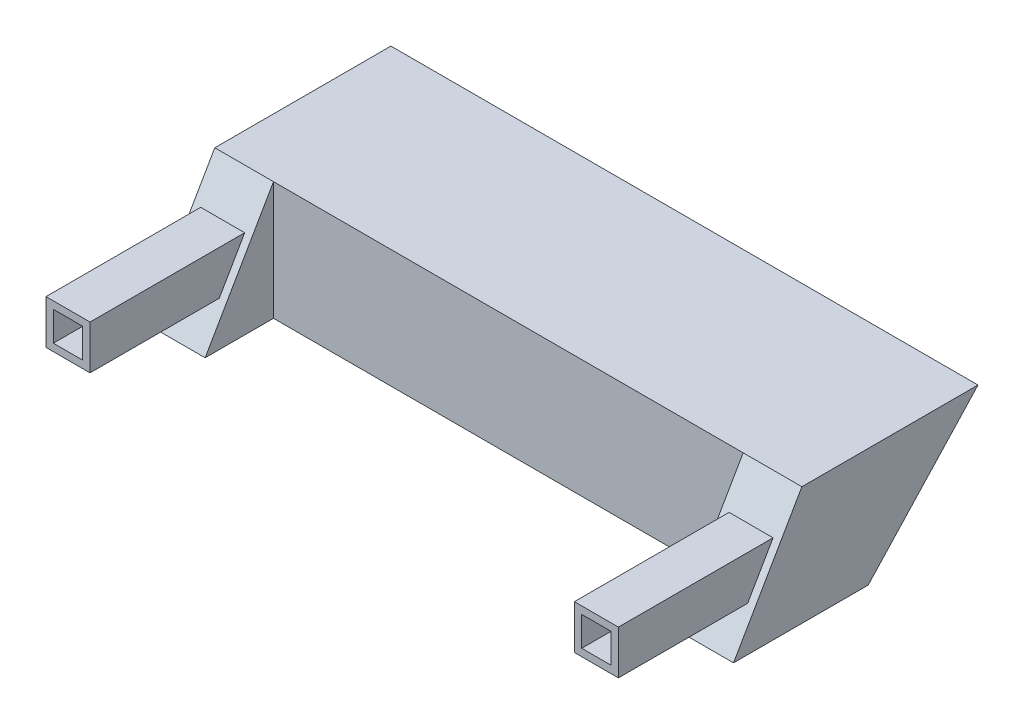
ISO-10303-21;
HEADER;
FILE_DESCRIPTION(('STEP AP214'),'2;1');
FILE_NAME('part.step','',(''),(''),'','','');
FILE_SCHEMA(('AUTOMOTIVE_DESIGN { 1 0 10303 214 1 1 1 1 }'));
ENDSEC;
DATA;
#1=APPLICATION_CONTEXT('core data for automotive mechanical design processes');
#2=APPLICATION_PROTOCOL_DEFINITION('international standard','automotive_design',2000,#1);
#3=PRODUCT_CONTEXT('',#1,'mechanical');
#4=PRODUCT('Part','Part','',(#3));
#5=PRODUCT_RELATED_PRODUCT_CATEGORY('part','',(#4));
#6=PRODUCT_DEFINITION_FORMATION('','',#4);
#7=PRODUCT_DEFINITION_CONTEXT('part definition',#1,'design');
#8=PRODUCT_DEFINITION('design','',#6,#7);
#9=PRODUCT_DEFINITION_SHAPE('','',#8);
#10=(LENGTH_UNIT() NAMED_UNIT(*) SI_UNIT(.MILLI.,.METRE.));
#11=(NAMED_UNIT(*) PLANE_ANGLE_UNIT() SI_UNIT($,.RADIAN.));
#12=(NAMED_UNIT(*) SI_UNIT($,.STERADIAN.) SOLID_ANGLE_UNIT());
#13=UNCERTAINTY_MEASURE_WITH_UNIT(LENGTH_MEASURE(1.E-05),#10,'distance_accuracy_value','');
#14=(GEOMETRIC_REPRESENTATION_CONTEXT(3) GLOBAL_UNCERTAINTY_ASSIGNED_CONTEXT((#13)) GLOBAL_UNIT_ASSIGNED_CONTEXT((#10,
#11,#12)) REPRESENTATION_CONTEXT('',''));
#15=CARTESIAN_POINT('',(0.,0.,0.));
#16=DIRECTION('',(0.,0.,1.));
#17=DIRECTION('',(1.,0.,0.));
#18=AXIS2_PLACEMENT_3D('',#15,#16,#17);
#19=CARTESIAN_POINT('',(127.,51.2148659668265,0.));
#20=DIRECTION('',(0.,-0.500000000000004,-0.866025403784436));
#21=DIRECTION('',(0.,0.866025403784436,-0.500000000000004));
#22=AXIS2_PLACEMENT_3D('',#19,#20,#21);
#23=PLANE('',#22);
#24=DIRECTION('',(0.,-0.866025403784436,0.500000000000004));
#25=VECTOR('',#24,1.);
#26=CARTESIAN_POINT('',(101.6,51.2148659668265,0.));
#27=LINE('',#26,#25);
#28=CARTESIAN_POINT('',(101.6,51.2148659668265,0.));
#29=VERTEX_POINT('',#28);
#30=CARTESIAN_POINT('',(101.6,0.,29.5689166524582));
#31=VERTEX_POINT('',#30);
#32=EDGE_CURVE('E318',#29,#31,#27,.T.);
#33=ORIENTED_EDGE('',*,*,#32,.T.);
#34=DIRECTION('',(-1.,0.,0.));
#35=VECTOR('',#34,1.);
#36=CARTESIAN_POINT('',(127.,0.,29.5689166524582));
#37=LINE('',#36,#35);
#38=CARTESIAN_POINT('',(127.,0.,29.5689166524582));
#39=VERTEX_POINT('',#38);
#40=EDGE_CURVE('E314',#39,#31,#37,.T.);
#41=ORIENTED_EDGE('',*,*,#40,.F.);
#42=DIRECTION('',(0.,-0.866025403784436,0.500000000000004));
#43=VECTOR('',#42,1.);
#44=CARTESIAN_POINT('',(127.,51.2148659668265,0.));
#45=LINE('',#44,#43);
#46=CARTESIAN_POINT('',(127.,51.2148659668265,0.));
#47=VERTEX_POINT('',#46);
#48=EDGE_CURVE('E311',#47,#39,#45,.T.);
#49=ORIENTED_EDGE('',*,*,#48,.F.);
#50=DIRECTION('',(-1.,0.,0.));
#51=VECTOR('',#50,1.);
#52=CARTESIAN_POINT('',(127.,51.2148659668265,0.));
#53=LINE('',#52,#51);
#54=EDGE_CURVE('E342',#47,#29,#53,.T.);
#55=ORIENTED_EDGE('',*,*,#54,.T.);
#56=EDGE_LOOP('',(#33,#41,#49,#55));
#57=FACE_BOUND('',#56,.T.);
#58=DIRECTION('',(0.,-0.866025403784436,0.500000000000004));
#59=VECTOR('',#58,1.);
#60=CARTESIAN_POINT('',(104.775,51.2148659668265,0.));
#61=LINE('',#60,#59);
#62=CARTESIAN_POINT('',(104.775,35.1324329834132,9.28519701219786));
#63=VERTEX_POINT('',#62);
#64=CARTESIAN_POINT('',(104.775,16.0824329834132,20.2837196402603));
#65=VERTEX_POINT('',#64);
#66=EDGE_CURVE('E371',#63,#65,#61,.T.);
#67=ORIENTED_EDGE('',*,*,#66,.F.);
#68=DIRECTION('',(-1.,0.,0.));
#69=VECTOR('',#68,1.);
#70=CARTESIAN_POINT('',(127.,35.1324329834132,9.28519701219784));
#71=LINE('',#70,#69);
#72=CARTESIAN_POINT('',(123.825,35.1324329834132,9.28519701219784));
#73=VERTEX_POINT('',#72);
#74=EDGE_CURVE('E362',#73,#63,#71,.T.);
#75=ORIENTED_EDGE('',*,*,#74,.F.);
#76=DIRECTION('',(0.,0.866025403784436,-0.500000000000004));
#77=VECTOR('',#76,1.);
#78=CARTESIAN_POINT('',(123.825,51.2148659668265,0.));
#79=LINE('',#78,#77);
#80=CARTESIAN_POINT('',(123.825,16.0824329834132,20.2837196402603));
#81=VERTEX_POINT('',#80);
#82=EDGE_CURVE('E365',#81,#73,#79,.T.);
#83=ORIENTED_EDGE('',*,*,#82,.F.);
#84=DIRECTION('',(1.,0.,0.));
#85=VECTOR('',#84,1.);
#86=CARTESIAN_POINT('',(127.,16.0824329834132,20.2837196402603));
#87=LINE('',#86,#85);
#88=EDGE_CURVE('E368',#65,#81,#87,.T.);
#89=ORIENTED_EDGE('',*,*,#88,.F.);
#90=EDGE_LOOP('',(#67,#75,#83,#89));
#91=FACE_BOUND('',#90,.T.);
#92=ADVANCED_FACE('F43',(#57,#91),#23,.F.);
#93=CARTESIAN_POINT('',(127.,0.,0.));
#94=DIRECTION('',(0.,0.,-1.));
#95=DIRECTION('',(-1.,0.,0.));
#96=AXIS2_PLACEMENT_3D('',#93,#94,#95);
#97=PLANE('',#96);
#98=DIRECTION('',(0.,1.,0.));
#99=VECTOR('',#98,1.);
#100=CARTESIAN_POINT('',(-101.6,51.2148659668265,0.));
#101=LINE('',#100,#99);
#102=CARTESIAN_POINT('',(-101.6,0.,0.));
#103=VERTEX_POINT('',#102);
#104=CARTESIAN_POINT('',(-101.6,51.2148659668265,0.));
#105=VERTEX_POINT('',#104);
#106=EDGE_CURVE('E294',#103,#105,#101,.T.);
#107=ORIENTED_EDGE('',*,*,#106,.F.);
#108=DIRECTION('',(-1.,0.,0.));
#109=VECTOR('',#108,1.);
#110=CARTESIAN_POINT('',(127.,0.,0.));
#111=LINE('',#110,#109);
#112=CARTESIAN_POINT('',(101.6,0.,0.));
#113=VERTEX_POINT('',#112);
#114=EDGE_CURVE('E333',#113,#103,#111,.T.);
#115=ORIENTED_EDGE('',*,*,#114,.F.);
#116=DIRECTION('',(0.,1.,0.));
#117=VECTOR('',#116,1.);
#118=CARTESIAN_POINT('',(101.6,51.2148659668265,0.));
#119=LINE('',#118,#117);
#120=EDGE_CURVE('E310',#113,#29,#119,.T.);
#121=ORIENTED_EDGE('',*,*,#120,.T.);
#122=EDGE_CURVE('E341',#29,#105,#53,.T.);
#123=ORIENTED_EDGE('',*,*,#122,.T.);
#124=EDGE_LOOP('',(#107,#115,#121,#123));
#125=FACE_BOUND('',#124,.T.);
#126=ADVANCED_FACE('F414',(#125),#97,.F.);
#127=CARTESIAN_POINT('',(127.,0.,-28.702));
#128=DIRECTION('',(0.,1.,0.));
#129=DIRECTION('',(0.,0.,1.));
#130=AXIS2_PLACEMENT_3D('',#127,#128,#129);
#131=PLANE('',#130);
#132=DIRECTION('',(0.,0.,-1.));
#133=VECTOR('',#132,1.);
#134=CARTESIAN_POINT('',(-127.,0.,-28.702));
#135=LINE('',#134,#133);
#136=CARTESIAN_POINT('',(-127.,0.,29.5689166524582));
#137=VERTEX_POINT('',#136);
#138=CARTESIAN_POINT('',(-127.,0.,-28.702));
#139=VERTEX_POINT('',#138);
#140=EDGE_CURVE('E323',#137,#139,#135,.T.);
#141=ORIENTED_EDGE('',*,*,#140,.T.);
#142=DIRECTION('',(-1.,0.,0.));
#143=VECTOR('',#142,1.);
#144=CARTESIAN_POINT('',(127.,0.,-28.702));
#145=LINE('',#144,#143);
#146=CARTESIAN_POINT('',(127.,0.,-28.702));
#147=VERTEX_POINT('',#146);
#148=EDGE_CURVE('E347',#147,#139,#145,.T.);
#149=ORIENTED_EDGE('',*,*,#148,.F.);
#150=DIRECTION('',(0.,0.,-1.));
#151=VECTOR('',#150,1.);
#152=CARTESIAN_POINT('',(127.,0.,-28.702));
#153=LINE('',#152,#151);
#154=EDGE_CURVE('E324',#39,#147,#153,.T.);
#155=ORIENTED_EDGE('',*,*,#154,.F.);
#156=ORIENTED_EDGE('',*,*,#40,.T.);
#157=DIRECTION('',(0.,0.,-1.));
#158=VECTOR('',#157,1.);
#159=CARTESIAN_POINT('',(101.6,0.,29.5689166524582));
#160=LINE('',#159,#158);
#161=EDGE_CURVE('E315',#31,#113,#160,.T.);
#162=ORIENTED_EDGE('',*,*,#161,.T.);
#163=ORIENTED_EDGE('',*,*,#114,.T.);
#164=DIRECTION('',(0.,0.,-1.));
#165=VECTOR('',#164,1.);
#166=CARTESIAN_POINT('',(-101.6,0.,29.5689166524582));
#167=LINE('',#166,#165);
#168=CARTESIAN_POINT('',(-101.6,0.,29.5689166524582));
#169=VERTEX_POINT('',#168);
#170=EDGE_CURVE('E302',#169,#103,#167,.T.);
#171=ORIENTED_EDGE('',*,*,#170,.F.);
#172=DIRECTION('',(1.,0.,0.));
#173=VECTOR('',#172,1.);
#174=CARTESIAN_POINT('',(-127.,0.,29.5689166524582));
#175=LINE('',#174,#173);
#176=EDGE_CURVE('E308',#137,#169,#175,.T.);
#177=ORIENTED_EDGE('',*,*,#176,.F.);
#178=EDGE_LOOP('',(#141,#149,#155,#156,#162,#163,#171,#177));
#179=FACE_BOUND('',#178,.T.);
#180=ADVANCED_FACE('F45',(#179),#131,.F.);
#181=CARTESIAN_POINT('',(127.,51.2148659668265,-76.2));
#182=DIRECTION('',(0.,0.68,0.733212111192934));
#183=DIRECTION('',(0.,-0.733212111192934,0.68));
#184=AXIS2_PLACEMENT_3D('',#181,#182,#183);
#185=PLANE('',#184);
#186=DIRECTION('',(0.,0.733212111192934,-0.68));
#187=VECTOR('',#186,1.);
#188=CARTESIAN_POINT('',(-127.,51.2148659668265,-76.2));
#189=LINE('',#188,#187);
#190=CARTESIAN_POINT('',(-127.,51.2148659668265,-76.2));
#191=VERTEX_POINT('',#190);
#192=EDGE_CURVE('E336',#139,#191,#189,.T.);
#193=ORIENTED_EDGE('',*,*,#192,.T.);
#194=DIRECTION('',(-1.,0.,0.));
#195=VECTOR('',#194,1.);
#196=CARTESIAN_POINT('',(127.,51.2148659668265,-76.2));
#197=LINE('',#196,#195);
#198=CARTESIAN_POINT('',(127.,51.2148659668265,-76.2));
#199=VERTEX_POINT('',#198);
#200=EDGE_CURVE('E344',#199,#191,#197,.T.);
#201=ORIENTED_EDGE('',*,*,#200,.F.);
#202=DIRECTION('',(0.,0.733212111192934,-0.68));
#203=VECTOR('',#202,1.);
#204=CARTESIAN_POINT('',(127.,51.2148659668265,-76.2));
#205=LINE('',#204,#203);
#206=EDGE_CURVE('E327',#147,#199,#205,.T.);
#207=ORIENTED_EDGE('',*,*,#206,.F.);
#208=ORIENTED_EDGE('',*,*,#148,.T.);
#209=EDGE_LOOP('',(#193,#201,#207,#208));
#210=FACE_BOUND('',#209,.T.);
#211=ADVANCED_FACE('F432',(#210),#185,.F.);
#212=CARTESIAN_POINT('',(127.,51.2148659668265,0.));
#213=DIRECTION('',(0.,-1.,0.));
#214=DIRECTION('',(0.,0.,-1.));
#215=AXIS2_PLACEMENT_3D('',#212,#213,#214);
#216=PLANE('',#215);
#217=DIRECTION('',(0.,0.,1.));
#218=VECTOR('',#217,1.);
#219=CARTESIAN_POINT('',(-127.,51.2148659668265,0.));
#220=LINE('',#219,#218);
#221=CARTESIAN_POINT('',(-127.,51.2148659668265,0.));
#222=VERTEX_POINT('',#221);
#223=EDGE_CURVE('E328',#191,#222,#220,.T.);
#224=ORIENTED_EDGE('',*,*,#223,.T.);
#225=DIRECTION('',(1.,0.,0.));
#226=VECTOR('',#225,1.);
#227=CARTESIAN_POINT('',(-127.,51.2148659668265,0.));
#228=LINE('',#227,#226);
#229=EDGE_CURVE('E298',#222,#105,#228,.T.);
#230=ORIENTED_EDGE('',*,*,#229,.T.);
#231=ORIENTED_EDGE('',*,*,#122,.F.);
#232=ORIENTED_EDGE('',*,*,#54,.F.);
#233=DIRECTION('',(0.,0.,1.));
#234=VECTOR('',#233,1.);
#235=CARTESIAN_POINT('',(127.,51.2148659668265,0.));
#236=LINE('',#235,#234);
#237=EDGE_CURVE('E330',#199,#47,#236,.T.);
#238=ORIENTED_EDGE('',*,*,#237,.F.);
#239=ORIENTED_EDGE('',*,*,#200,.T.);
#240=EDGE_LOOP('',(#224,#230,#231,#232,#238,#239));
#241=FACE_BOUND('',#240,.T.);
#242=ADVANCED_FACE('F424',(#241),#216,.F.);
#243=CARTESIAN_POINT('',(127.,0.,0.));
#244=DIRECTION('',(-1.,0.,0.));
#245=DIRECTION('',(0.,0.,1.));
#246=AXIS2_PLACEMENT_3D('',#243,#244,#245);
#247=PLANE('',#246);
#248=ORIENTED_EDGE('',*,*,#154,.T.);
#249=ORIENTED_EDGE('',*,*,#206,.T.);
#250=ORIENTED_EDGE('',*,*,#237,.T.);
#251=ORIENTED_EDGE('',*,*,#48,.T.);
#252=EDGE_LOOP('',(#248,#249,#250,#251));
#253=FACE_BOUND('',#252,.T.);
#254=ADVANCED_FACE('F434',(#253),#247,.F.);
#255=CARTESIAN_POINT('',(-127.,0.,0.));
#256=DIRECTION('',(-1.,0.,0.));
#257=DIRECTION('',(0.,0.,1.));
#258=AXIS2_PLACEMENT_3D('',#255,#256,#257);
#259=PLANE('',#258);
#260=ORIENTED_EDGE('',*,*,#140,.F.);
#261=DIRECTION('',(0.,-0.866025403784436,0.500000000000004));
#262=VECTOR('',#261,1.);
#263=CARTESIAN_POINT('',(-127.,51.2148659668265,0.));
#264=LINE('',#263,#262);
#265=EDGE_CURVE('E295',#222,#137,#264,.T.);
#266=ORIENTED_EDGE('',*,*,#265,.F.);
#267=ORIENTED_EDGE('',*,*,#223,.F.);
#268=ORIENTED_EDGE('',*,*,#192,.F.);
#269=EDGE_LOOP('',(#260,#266,#267,#268));
#270=FACE_BOUND('',#269,.T.);
#271=ADVANCED_FACE('F429',(#270),#259,.T.);
#272=CARTESIAN_POINT('',(101.6,0.,0.));
#273=DIRECTION('',(1.,0.,0.));
#274=DIRECTION('',(0.,0.,-1.));
#275=AXIS2_PLACEMENT_3D('',#272,#273,#274);
#276=PLANE('',#275);
#277=ORIENTED_EDGE('',*,*,#120,.F.);
#278=ORIENTED_EDGE('',*,*,#161,.F.);
#279=ORIENTED_EDGE('',*,*,#32,.F.);
#280=EDGE_LOOP('',(#277,#278,#279));
#281=FACE_BOUND('',#280,.T.);
#282=ADVANCED_FACE('F402',(#281),#276,.F.);
#283=CARTESIAN_POINT('',(-127.,51.2148659668265,0.));
#284=DIRECTION('',(0.,0.500000000000004,0.866025403784436));
#285=DIRECTION('',(0.,-0.866025403784436,0.500000000000004));
#286=AXIS2_PLACEMENT_3D('',#283,#284,#285);
#287=PLANE('',#286);
#288=DIRECTION('',(0.,0.866025403784436,-0.500000000000004));
#289=VECTOR('',#288,1.);
#290=CARTESIAN_POINT('',(-104.775,51.2148659668265,0.));
#291=LINE('',#290,#289);
#292=CARTESIAN_POINT('',(-104.775,16.0824329834132,20.2837196402604));
#293=VERTEX_POINT('',#292);
#294=CARTESIAN_POINT('',(-104.775,35.1324329834132,9.28519701219784));
#295=VERTEX_POINT('',#294);
#296=EDGE_CURVE('E11',#293,#295,#291,.T.);
#297=ORIENTED_EDGE('',*,*,#296,.F.);
#298=DIRECTION('',(1.,0.,0.));
#299=VECTOR('',#298,1.);
#300=CARTESIAN_POINT('',(-127.,16.0824329834132,20.2837196402603));
#301=LINE('',#300,#299);
#302=CARTESIAN_POINT('',(-123.825,16.0824329834132,20.2837196402603));
#303=VERTEX_POINT('',#302);
#304=EDGE_CURVE('E383',#303,#293,#301,.T.);
#305=ORIENTED_EDGE('',*,*,#304,.F.);
#306=DIRECTION('',(0.,-0.866025403784436,0.500000000000004));
#307=VECTOR('',#306,1.);
#308=CARTESIAN_POINT('',(-123.825,51.2148659668265,0.));
#309=LINE('',#308,#307);
#310=CARTESIAN_POINT('',(-123.825,35.1324329834132,9.28519701219784));
#311=VERTEX_POINT('',#310);
#312=EDGE_CURVE('E61',#311,#303,#309,.T.);
#313=ORIENTED_EDGE('',*,*,#312,.F.);
#314=DIRECTION('',(-1.,0.,0.));
#315=VECTOR('',#314,1.);
#316=CARTESIAN_POINT('',(-127.,35.1324329834132,9.28519701219784));
#317=LINE('',#316,#315);
#318=EDGE_CURVE('E51',#295,#311,#317,.T.);
#319=ORIENTED_EDGE('',*,*,#318,.F.);
#320=EDGE_LOOP('',(#297,#305,#313,#319));
#321=FACE_BOUND('',#320,.T.);
#322=DIRECTION('',(0.,-0.866025403784436,0.500000000000004));
#323=VECTOR('',#322,1.);
#324=CARTESIAN_POINT('',(-101.6,51.2148659668265,0.));
#325=LINE('',#324,#323);
#326=EDGE_CURVE('E299',#105,#169,#325,.T.);
#327=ORIENTED_EDGE('',*,*,#326,.F.);
#328=ORIENTED_EDGE('',*,*,#229,.F.);
#329=ORIENTED_EDGE('',*,*,#265,.T.);
#330=ORIENTED_EDGE('',*,*,#176,.T.);
#331=EDGE_LOOP('',(#327,#328,#329,#330));
#332=FACE_BOUND('',#331,.T.);
#333=ADVANCED_FACE('F398',(#321,#332),#287,.T.);
#334=CARTESIAN_POINT('',(-101.6,0.,0.));
#335=DIRECTION('',(-1.,0.,0.));
#336=DIRECTION('',(0.,0.,-1.));
#337=AXIS2_PLACEMENT_3D('',#334,#335,#336);
#338=PLANE('',#337);
#339=ORIENTED_EDGE('',*,*,#106,.T.);
#340=ORIENTED_EDGE('',*,*,#326,.T.);
#341=ORIENTED_EDGE('',*,*,#170,.T.);
#342=EDGE_LOOP('',(#339,#340,#341));
#343=FACE_BOUND('',#342,.T.);
#344=ADVANCED_FACE('F401',(#343),#338,.F.);
#345=CARTESIAN_POINT('',(104.775,35.1324329834132,76.2));
#346=DIRECTION('',(1.,0.,0.));
#347=DIRECTION('',(0.,0.,-1.));
#348=AXIS2_PLACEMENT_3D('',#345,#346,#347);
#349=PLANE('',#348);
#350=DIRECTION('',(0.,0.,-1.));
#351=VECTOR('',#350,1.);
#352=CARTESIAN_POINT('',(104.775,35.1324329834132,76.2));
#353=LINE('',#352,#351);
#354=CARTESIAN_POINT('',(104.775,35.1324329834132,76.2));
#355=VERTEX_POINT('',#354);
#356=EDGE_CURVE('E282',#355,#63,#353,.T.);
#357=ORIENTED_EDGE('',*,*,#356,.T.);
#358=ORIENTED_EDGE('',*,*,#66,.T.);
#359=DIRECTION('',(0.,0.,-1.));
#360=VECTOR('',#359,1.);
#361=CARTESIAN_POINT('',(104.775,16.0824329834132,76.2));
#362=LINE('',#361,#360);
#363=CARTESIAN_POINT('',(104.775,16.0824329834132,76.2));
#364=VERTEX_POINT('',#363);
#365=EDGE_CURVE('E291',#364,#65,#362,.T.);
#366=ORIENTED_EDGE('',*,*,#365,.F.);
#367=DIRECTION('',(0.,-1.,0.));
#368=VECTOR('',#367,1.);
#369=CARTESIAN_POINT('',(104.775,35.1324329834132,76.2));
#370=LINE('',#369,#368);
#371=EDGE_CURVE('E273',#355,#364,#370,.T.);
#372=ORIENTED_EDGE('',*,*,#371,.F.);
#373=EDGE_LOOP('',(#357,#358,#366,#372));
#374=FACE_BOUND('',#373,.T.);
#375=ADVANCED_FACE('F448',(#374),#349,.F.);
#376=CARTESIAN_POINT('',(104.775,16.0824329834132,76.2));
#377=DIRECTION('',(0.,1.,0.));
#378=DIRECTION('',(0.,0.,1.));
#379=AXIS2_PLACEMENT_3D('',#376,#377,#378);
#380=PLANE('',#379);
#381=ORIENTED_EDGE('',*,*,#365,.T.);
#382=ORIENTED_EDGE('',*,*,#88,.T.);
#383=DIRECTION('',(0.,0.,-1.));
#384=VECTOR('',#383,1.);
#385=CARTESIAN_POINT('',(123.825,16.0824329834132,76.2));
#386=LINE('',#385,#384);
#387=CARTESIAN_POINT('',(123.825,16.0824329834132,76.2));
#388=VERTEX_POINT('',#387);
#389=EDGE_CURVE('E288',#388,#81,#386,.T.);
#390=ORIENTED_EDGE('',*,*,#389,.F.);
#391=DIRECTION('',(1.,0.,0.));
#392=VECTOR('',#391,1.);
#393=CARTESIAN_POINT('',(104.775,16.0824329834132,76.2));
#394=LINE('',#393,#392);
#395=EDGE_CURVE('E276',#364,#388,#394,.T.);
#396=ORIENTED_EDGE('',*,*,#395,.F.);
#397=EDGE_LOOP('',(#381,#382,#390,#396));
#398=FACE_BOUND('',#397,.T.);
#399=ADVANCED_FACE('F457',(#398),#380,.F.);
#400=CARTESIAN_POINT('',(123.825,35.1324329834132,76.2));
#401=DIRECTION('',(-1.,0.,0.));
#402=DIRECTION('',(0.,0.,1.));
#403=AXIS2_PLACEMENT_3D('',#400,#401,#402);
#404=PLANE('',#403);
#405=ORIENTED_EDGE('',*,*,#389,.T.);
#406=ORIENTED_EDGE('',*,*,#82,.T.);
#407=DIRECTION('',(0.,0.,-1.));
#408=VECTOR('',#407,1.);
#409=CARTESIAN_POINT('',(123.825,35.1324329834132,76.2));
#410=LINE('',#409,#408);
#411=CARTESIAN_POINT('',(123.825,35.1324329834132,76.2));
#412=VERTEX_POINT('',#411);
#413=EDGE_CURVE('E285',#412,#73,#410,.T.);
#414=ORIENTED_EDGE('',*,*,#413,.F.);
#415=DIRECTION('',(0.,1.,0.));
#416=VECTOR('',#415,1.);
#417=CARTESIAN_POINT('',(123.825,35.1324329834132,76.2));
#418=LINE('',#417,#416);
#419=EDGE_CURVE('E278',#388,#412,#418,.T.);
#420=ORIENTED_EDGE('',*,*,#419,.F.);
#421=EDGE_LOOP('',(#405,#406,#414,#420));
#422=FACE_BOUND('',#421,.T.);
#423=ADVANCED_FACE('F455',(#422),#404,.F.);
#424=CARTESIAN_POINT('',(104.775,35.1324329834132,76.2));
#425=DIRECTION('',(0.,-1.,0.));
#426=DIRECTION('',(0.,0.,-1.));
#427=AXIS2_PLACEMENT_3D('',#424,#425,#426);
#428=PLANE('',#427);
#429=ORIENTED_EDGE('',*,*,#413,.T.);
#430=ORIENTED_EDGE('',*,*,#74,.T.);
#431=ORIENTED_EDGE('',*,*,#356,.F.);
#432=DIRECTION('',(-1.,0.,0.));
#433=VECTOR('',#432,1.);
#434=CARTESIAN_POINT('',(104.775,35.1324329834132,76.2));
#435=LINE('',#434,#433);
#436=EDGE_CURVE('E280',#412,#355,#435,.T.);
#437=ORIENTED_EDGE('',*,*,#436,.F.);
#438=EDGE_LOOP('',(#429,#430,#431,#437));
#439=FACE_BOUND('',#438,.T.);
#440=ADVANCED_FACE('F444',(#439),#428,.F.);
#441=CARTESIAN_POINT('',(107.95,31.9574329834132,76.2));
#442=DIRECTION('',(1.,0.,0.));
#443=DIRECTION('',(0.,0.,-1.));
#444=AXIS2_PLACEMENT_3D('',#441,#442,#443);
#445=PLANE('',#444);
#446=DIRECTION('',(0.,-0.866025403784436,0.500000000000004));
#447=VECTOR('',#446,1.);
#448=CARTESIAN_POINT('',(107.95,51.2148659668265,0.));
#449=LINE('',#448,#447);
#450=CARTESIAN_POINT('',(107.95,31.9574329834132,11.1182841168749));
#451=VERTEX_POINT('',#450);
#452=CARTESIAN_POINT('',(107.95,19.2574329834132,18.4506325355833));
#453=VERTEX_POINT('',#452);
#454=EDGE_CURVE('E359',#451,#453,#449,.T.);
#455=ORIENTED_EDGE('',*,*,#454,.F.);
#456=DIRECTION('',(0.,0.,-1.));
#457=VECTOR('',#456,1.);
#458=CARTESIAN_POINT('',(107.95,31.9574329834132,76.2));
#459=LINE('',#458,#457);
#460=CARTESIAN_POINT('',(107.95,31.9574329834132,76.2));
#461=VERTEX_POINT('',#460);
#462=EDGE_CURVE('E262',#461,#451,#459,.T.);
#463=ORIENTED_EDGE('',*,*,#462,.F.);
#464=DIRECTION('',(0.,-1.,0.));
#465=VECTOR('',#464,1.);
#466=CARTESIAN_POINT('',(107.95,31.9574329834132,76.2));
#467=LINE('',#466,#465);
#468=CARTESIAN_POINT('',(107.95,19.2574329834132,76.2));
#469=VERTEX_POINT('',#468);
#470=EDGE_CURVE('E253',#461,#469,#467,.T.);
#471=ORIENTED_EDGE('',*,*,#470,.T.);
#472=DIRECTION('',(0.,0.,-1.));
#473=VECTOR('',#472,1.);
#474=CARTESIAN_POINT('',(107.95,19.2574329834132,76.2));
#475=LINE('',#474,#473);
#476=EDGE_CURVE('E270',#469,#453,#475,.T.);
#477=ORIENTED_EDGE('',*,*,#476,.T.);
#478=EDGE_LOOP('',(#455,#463,#471,#477));
#479=FACE_BOUND('',#478,.T.);
#480=ADVANCED_FACE('F535',(#479),#445,.T.);
#481=CARTESIAN_POINT('',(107.95,19.2574329834132,76.2));
#482=DIRECTION('',(0.,1.,0.));
#483=DIRECTION('',(-1.,0.,0.));
#484=AXIS2_PLACEMENT_3D('',#481,#482,#483);
#485=PLANE('',#484);
#486=DIRECTION('',(1.,0.,0.));
#487=VECTOR('',#486,1.);
#488=CARTESIAN_POINT('',(127.,19.2574329834132,18.4506325355832));
#489=LINE('',#488,#487);
#490=CARTESIAN_POINT('',(120.65,19.2574329834132,18.4506325355833));
#491=VERTEX_POINT('',#490);
#492=EDGE_CURVE('E356',#453,#491,#489,.T.);
#493=ORIENTED_EDGE('',*,*,#492,.F.);
#494=ORIENTED_EDGE('',*,*,#476,.F.);
#495=DIRECTION('',(1.,0.,0.));
#496=VECTOR('',#495,1.);
#497=CARTESIAN_POINT('',(107.95,19.2574329834132,76.2));
#498=LINE('',#497,#496);
#499=CARTESIAN_POINT('',(120.65,19.2574329834132,76.2));
#500=VERTEX_POINT('',#499);
#501=EDGE_CURVE('E255',#469,#500,#498,.T.);
#502=ORIENTED_EDGE('',*,*,#501,.T.);
#503=DIRECTION('',(0.,0.,-1.));
#504=VECTOR('',#503,1.);
#505=CARTESIAN_POINT('',(120.65,19.2574329834132,76.2));
#506=LINE('',#505,#504);
#507=EDGE_CURVE('E267',#500,#491,#506,.T.);
#508=ORIENTED_EDGE('',*,*,#507,.T.);
#509=EDGE_LOOP('',(#493,#494,#502,#508));
#510=FACE_BOUND('',#509,.T.);
#511=ADVANCED_FACE('F543',(#510),#485,.T.);
#512=CARTESIAN_POINT('',(120.65,31.9574329834132,76.2));
#513=DIRECTION('',(-1.,0.,0.));
#514=DIRECTION('',(0.,0.,1.));
#515=AXIS2_PLACEMENT_3D('',#512,#513,#514);
#516=PLANE('',#515);
#517=DIRECTION('',(0.,0.866025403784436,-0.500000000000004));
#518=VECTOR('',#517,1.);
#519=CARTESIAN_POINT('',(120.65,51.2148659668265,0.));
#520=LINE('',#519,#518);
#521=CARTESIAN_POINT('',(120.65,31.9574329834132,11.1182841168749));
#522=VERTEX_POINT('',#521);
#523=EDGE_CURVE('E353',#491,#522,#520,.T.);
#524=ORIENTED_EDGE('',*,*,#523,.F.);
#525=ORIENTED_EDGE('',*,*,#507,.F.);
#526=DIRECTION('',(0.,1.,0.));
#527=VECTOR('',#526,1.);
#528=CARTESIAN_POINT('',(120.65,31.9574329834132,76.2));
#529=LINE('',#528,#527);
#530=CARTESIAN_POINT('',(120.65,31.9574329834132,76.2));
#531=VERTEX_POINT('',#530);
#532=EDGE_CURVE('E257',#500,#531,#529,.T.);
#533=ORIENTED_EDGE('',*,*,#532,.T.);
#534=DIRECTION('',(0.,0.,-1.));
#535=VECTOR('',#534,1.);
#536=CARTESIAN_POINT('',(120.65,31.9574329834132,76.2));
#537=LINE('',#536,#535);
#538=EDGE_CURVE('E264',#531,#522,#537,.T.);
#539=ORIENTED_EDGE('',*,*,#538,.T.);
#540=EDGE_LOOP('',(#524,#525,#533,#539));
#541=FACE_BOUND('',#540,.T.);
#542=ADVANCED_FACE('F553',(#541),#516,.T.);
#543=CARTESIAN_POINT('',(107.95,31.9574329834132,76.2));
#544=DIRECTION('',(0.,-1.,0.));
#545=DIRECTION('',(0.,0.,-1.));
#546=AXIS2_PLACEMENT_3D('',#543,#544,#545);
#547=PLANE('',#546);
#548=DIRECTION('',(-1.,0.,0.));
#549=VECTOR('',#548,1.);
#550=CARTESIAN_POINT('',(127.,31.9574329834132,11.1182841168749));
#551=LINE('',#550,#549);
#552=EDGE_CURVE('E350',#522,#451,#551,.T.);
#553=ORIENTED_EDGE('',*,*,#552,.F.);
#554=ORIENTED_EDGE('',*,*,#538,.F.);
#555=DIRECTION('',(-1.,0.,0.));
#556=VECTOR('',#555,1.);
#557=CARTESIAN_POINT('',(107.95,31.9574329834132,76.2));
#558=LINE('',#557,#556);
#559=EDGE_CURVE('E260',#531,#461,#558,.T.);
#560=ORIENTED_EDGE('',*,*,#559,.T.);
#561=ORIENTED_EDGE('',*,*,#462,.T.);
#562=EDGE_LOOP('',(#553,#554,#560,#561));
#563=FACE_BOUND('',#562,.T.);
#564=ADVANCED_FACE('F563',(#563),#547,.T.);
#565=CARTESIAN_POINT('',(0.,0.,76.2));
#566=DIRECTION('',(0.,0.,1.));
#567=DIRECTION('',(1.,0.,0.));
#568=AXIS2_PLACEMENT_3D('',#565,#566,#567);
#569=PLANE('',#568);
#570=ORIENTED_EDGE('',*,*,#371,.T.);
#571=ORIENTED_EDGE('',*,*,#395,.T.);
#572=ORIENTED_EDGE('',*,*,#419,.T.);
#573=ORIENTED_EDGE('',*,*,#436,.T.);
#574=EDGE_LOOP('',(#570,#571,#572,#573));
#575=FACE_BOUND('',#574,.T.);
#576=ORIENTED_EDGE('',*,*,#501,.F.);
#577=ORIENTED_EDGE('',*,*,#470,.F.);
#578=ORIENTED_EDGE('',*,*,#559,.F.);
#579=ORIENTED_EDGE('',*,*,#532,.F.);
#580=EDGE_LOOP('',(#576,#577,#578,#579));
#581=FACE_BOUND('',#580,.T.);
#582=ADVANCED_FACE('F450',(#575,#581),#569,.T.);
#583=ORIENTED_EDGE('',*,*,#552,.T.);
#584=ORIENTED_EDGE('',*,*,#454,.T.);
#585=ORIENTED_EDGE('',*,*,#492,.T.);
#586=ORIENTED_EDGE('',*,*,#523,.T.);
#587=EDGE_LOOP('',(#583,#584,#585,#586));
#588=FACE_BOUND('',#587,.T.);
#589=ADVANCED_FACE('F439',(#588),#23,.F.);
#590=CARTESIAN_POINT('',(-104.775,35.1324329834132,76.2));
#591=DIRECTION('',(1.,0.,0.));
#592=DIRECTION('',(0.,0.,-1.));
#593=AXIS2_PLACEMENT_3D('',#590,#591,#592);
#594=PLANE('',#593);
#595=DIRECTION('',(0.,0.,-1.));
#596=VECTOR('',#595,1.);
#597=CARTESIAN_POINT('',(-104.775,16.0824329834132,76.2));
#598=LINE('',#597,#596);
#599=CARTESIAN_POINT('',(-104.775,16.0824329834132,76.2));
#600=VERTEX_POINT('',#599);
#601=EDGE_CURVE('E241',#600,#293,#598,.T.);
#602=ORIENTED_EDGE('',*,*,#601,.T.);
#603=ORIENTED_EDGE('',*,*,#296,.T.);
#604=DIRECTION('',(0.,0.,-1.));
#605=VECTOR('',#604,1.);
#606=CARTESIAN_POINT('',(-104.775,35.1324329834132,76.2));
#607=LINE('',#606,#605);
#608=CARTESIAN_POINT('',(-104.775,35.1324329834132,76.2));
#609=VERTEX_POINT('',#608);
#610=EDGE_CURVE('E250',#609,#295,#607,.T.);
#611=ORIENTED_EDGE('',*,*,#610,.F.);
#612=DIRECTION('',(0.,-1.,0.));
#613=VECTOR('',#612,1.);
#614=CARTESIAN_POINT('',(-104.775,35.1324329834132,76.2));
#615=LINE('',#614,#613);
#616=EDGE_CURVE('E206',#609,#600,#615,.T.);
#617=ORIENTED_EDGE('',*,*,#616,.T.);
#618=EDGE_LOOP('',(#602,#603,#611,#617));
#619=FACE_BOUND('',#618,.T.);
#620=ADVANCED_FACE('F397',(#619),#594,.T.);
#621=CARTESIAN_POINT('',(-104.775,35.1324329834132,76.2));
#622=DIRECTION('',(0.,1.,0.));
#623=DIRECTION('',(0.,0.,1.));
#624=AXIS2_PLACEMENT_3D('',#621,#622,#623);
#625=PLANE('',#624);
#626=ORIENTED_EDGE('',*,*,#610,.T.);
#627=ORIENTED_EDGE('',*,*,#318,.T.);
#628=DIRECTION('',(0.,0.,-1.));
#629=VECTOR('',#628,1.);
#630=CARTESIAN_POINT('',(-123.825,35.1324329834132,76.2));
#631=LINE('',#630,#629);
#632=CARTESIAN_POINT('',(-123.825,35.1324329834132,76.2));
#633=VERTEX_POINT('',#632);
#634=EDGE_CURVE('E247',#633,#311,#631,.T.);
#635=ORIENTED_EDGE('',*,*,#634,.F.);
#636=DIRECTION('',(1.,0.,0.));
#637=VECTOR('',#636,1.);
#638=CARTESIAN_POINT('',(-104.775,35.1324329834132,76.2));
#639=LINE('',#638,#637);
#640=EDGE_CURVE('E232',#633,#609,#639,.T.);
#641=ORIENTED_EDGE('',*,*,#640,.T.);
#642=EDGE_LOOP('',(#626,#627,#635,#641));
#643=FACE_BOUND('',#642,.T.);
#644=ADVANCED_FACE('F387',(#643),#625,.T.);
#645=CARTESIAN_POINT('',(-123.825,35.1324329834132,76.2));
#646=DIRECTION('',(-1.,0.,0.));
#647=DIRECTION('',(0.,0.,1.));
#648=AXIS2_PLACEMENT_3D('',#645,#646,#647);
#649=PLANE('',#648);
#650=ORIENTED_EDGE('',*,*,#634,.T.);
#651=ORIENTED_EDGE('',*,*,#312,.T.);
#652=DIRECTION('',(0.,0.,-1.));
#653=VECTOR('',#652,1.);
#654=CARTESIAN_POINT('',(-123.825,16.0824329834132,76.2));
#655=LINE('',#654,#653);
#656=CARTESIAN_POINT('',(-123.825,16.0824329834132,76.2));
#657=VERTEX_POINT('',#656);
#658=EDGE_CURVE('E244',#657,#303,#655,.T.);
#659=ORIENTED_EDGE('',*,*,#658,.F.);
#660=DIRECTION('',(0.,1.,0.));
#661=VECTOR('',#660,1.);
#662=CARTESIAN_POINT('',(-123.825,35.1324329834132,76.2));
#663=LINE('',#662,#661);
#664=EDGE_CURVE('E235',#657,#633,#663,.T.);
#665=ORIENTED_EDGE('',*,*,#664,.T.);
#666=EDGE_LOOP('',(#650,#651,#659,#665));
#667=FACE_BOUND('',#666,.T.);
#668=ADVANCED_FACE('F390',(#667),#649,.T.);
#669=CARTESIAN_POINT('',(-104.775,16.0824329834132,76.2));
#670=DIRECTION('',(0.,-1.,0.));
#671=DIRECTION('',(0.,0.,-1.));
#672=AXIS2_PLACEMENT_3D('',#669,#670,#671);
#673=PLANE('',#672);
#674=ORIENTED_EDGE('',*,*,#658,.T.);
#675=ORIENTED_EDGE('',*,*,#304,.T.);
#676=ORIENTED_EDGE('',*,*,#601,.F.);
#677=DIRECTION('',(-1.,0.,0.));
#678=VECTOR('',#677,1.);
#679=CARTESIAN_POINT('',(-104.775,16.0824329834132,76.2));
#680=LINE('',#679,#678);
#681=EDGE_CURVE('E238',#600,#657,#680,.T.);
#682=ORIENTED_EDGE('',*,*,#681,.T.);
#683=EDGE_LOOP('',(#674,#675,#676,#682));
#684=FACE_BOUND('',#683,.T.);
#685=ADVANCED_FACE('F395',(#684),#673,.T.);
#686=CARTESIAN_POINT('',(0.,0.,76.2));
#687=DIRECTION('',(0.,0.,1.));
#688=DIRECTION('',(-1.,0.,0.));
#689=AXIS2_PLACEMENT_3D('',#686,#687,#688);
#690=PLANE('',#689);
#691=DIRECTION('',(0.,-1.,0.));
#692=VECTOR('',#691,1.);
#693=CARTESIAN_POINT('',(-107.95,31.9574329834132,76.2));
#694=LINE('',#693,#692);
#695=CARTESIAN_POINT('',(-107.95,31.9574329834132,76.2));
#696=VERTEX_POINT('',#695);
#697=CARTESIAN_POINT('',(-107.95,19.2574329834132,76.2));
#698=VERTEX_POINT('',#697);
#699=EDGE_CURVE('E210',#696,#698,#694,.T.);
#700=ORIENTED_EDGE('',*,*,#699,.T.);
#701=DIRECTION('',(-1.,0.,0.));
#702=VECTOR('',#701,1.);
#703=CARTESIAN_POINT('',(-107.95,19.2574329834132,76.2));
#704=LINE('',#703,#702);
#705=CARTESIAN_POINT('',(-120.65,19.2574329834132,76.2));
#706=VERTEX_POINT('',#705);
#707=EDGE_CURVE('E221',#698,#706,#704,.T.);
#708=ORIENTED_EDGE('',*,*,#707,.T.);
#709=DIRECTION('',(0.,1.,0.));
#710=VECTOR('',#709,1.);
#711=CARTESIAN_POINT('',(-120.65,31.9574329834132,76.2));
#712=LINE('',#711,#710);
#713=CARTESIAN_POINT('',(-120.65,31.9574329834132,76.2));
#714=VERTEX_POINT('',#713);
#715=EDGE_CURVE('E219',#706,#714,#712,.T.);
#716=ORIENTED_EDGE('',*,*,#715,.T.);
#717=DIRECTION('',(1.,0.,0.));
#718=VECTOR('',#717,1.);
#719=CARTESIAN_POINT('',(-107.95,31.9574329834132,76.2));
#720=LINE('',#719,#718);
#721=EDGE_CURVE('E199',#714,#696,#720,.T.);
#722=ORIENTED_EDGE('',*,*,#721,.T.);
#723=EDGE_LOOP('',(#700,#708,#716,#722));
#724=FACE_BOUND('',#723,.T.);
#725=ORIENTED_EDGE('',*,*,#616,.F.);
#726=ORIENTED_EDGE('',*,*,#640,.F.);
#727=ORIENTED_EDGE('',*,*,#664,.F.);
#728=ORIENTED_EDGE('',*,*,#681,.F.);
#729=EDGE_LOOP('',(#725,#726,#727,#728));
#730=FACE_BOUND('',#729,.T.);
#731=ADVANCED_FACE('F217',(#724,#730),#690,.T.);
#732=CARTESIAN_POINT('',(-107.95,31.9574329834132,76.2));
#733=DIRECTION('',(1.,0.,0.));
#734=DIRECTION('',(0.,0.,-1.));
#735=AXIS2_PLACEMENT_3D('',#732,#733,#734);
#736=PLANE('',#735);
#737=DIRECTION('',(0.,0.866025403784436,-0.500000000000004));
#738=VECTOR('',#737,1.);
#739=CARTESIAN_POINT('',(-107.95,51.2148659668265,0.));
#740=LINE('',#739,#738);
#741=CARTESIAN_POINT('',(-107.95,19.2574329834132,18.4506325355832));
#742=VERTEX_POINT('',#741);
#743=CARTESIAN_POINT('',(-107.95,31.9574329834132,11.1182841168749));
#744=VERTEX_POINT('',#743);
#745=EDGE_CURVE('E381',#742,#744,#740,.T.);
#746=ORIENTED_EDGE('',*,*,#745,.F.);
#747=DIRECTION('',(0.,0.,-1.));
#748=VECTOR('',#747,1.);
#749=CARTESIAN_POINT('',(-107.95,19.2574329834132,76.2));
#750=LINE('',#749,#748);
#751=EDGE_CURVE('E212',#698,#742,#750,.T.);
#752=ORIENTED_EDGE('',*,*,#751,.F.);
#753=ORIENTED_EDGE('',*,*,#699,.F.);
#754=DIRECTION('',(0.,0.,-1.));
#755=VECTOR('',#754,1.);
#756=CARTESIAN_POINT('',(-107.95,31.9574329834132,76.2));
#757=LINE('',#756,#755);
#758=EDGE_CURVE('E194',#696,#744,#757,.T.);
#759=ORIENTED_EDGE('',*,*,#758,.T.);
#760=EDGE_LOOP('',(#746,#752,#753,#759));
#761=FACE_BOUND('',#760,.T.);
#762=ADVANCED_FACE('F211',(#761),#736,.F.);
#763=CARTESIAN_POINT('',(-107.95,31.9574329834132,76.2));
#764=DIRECTION('',(0.,1.,0.));
#765=DIRECTION('',(0.,0.,1.));
#766=AXIS2_PLACEMENT_3D('',#763,#764,#765);
#767=PLANE('',#766);
#768=DIRECTION('',(-1.,0.,0.));
#769=VECTOR('',#768,1.);
#770=CARTESIAN_POINT('',(-127.,31.9574329834132,11.1182841168749));
#771=LINE('',#770,#769);
#772=CARTESIAN_POINT('',(-120.65,31.9574329834132,11.1182841168749));
#773=VERTEX_POINT('',#772);
#774=EDGE_CURVE('E202',#744,#773,#771,.T.);
#775=ORIENTED_EDGE('',*,*,#774,.F.);
#776=ORIENTED_EDGE('',*,*,#758,.F.);
#777=ORIENTED_EDGE('',*,*,#721,.F.);
#778=DIRECTION('',(0.,0.,-1.));
#779=VECTOR('',#778,1.);
#780=CARTESIAN_POINT('',(-120.65,31.9574329834132,76.2));
#781=LINE('',#780,#779);
#782=EDGE_CURVE('E207',#714,#773,#781,.T.);
#783=ORIENTED_EDGE('',*,*,#782,.T.);
#784=EDGE_LOOP('',(#775,#776,#777,#783));
#785=FACE_BOUND('',#784,.T.);
#786=ADVANCED_FACE('F196',(#785),#767,.F.);
#787=CARTESIAN_POINT('',(-120.65,31.9574329834132,76.2));
#788=DIRECTION('',(-1.,0.,0.));
#789=DIRECTION('',(0.,0.,1.));
#790=AXIS2_PLACEMENT_3D('',#787,#788,#789);
#791=PLANE('',#790);
#792=DIRECTION('',(0.,-0.866025403784436,0.500000000000004));
#793=VECTOR('',#792,1.);
#794=CARTESIAN_POINT('',(-120.65,51.2148659668265,0.));
#795=LINE('',#794,#793);
#796=CARTESIAN_POINT('',(-120.65,19.2574329834132,18.4506325355833));
#797=VERTEX_POINT('',#796);
#798=EDGE_CURVE('E377',#773,#797,#795,.T.);
#799=ORIENTED_EDGE('',*,*,#798,.F.);
#800=ORIENTED_EDGE('',*,*,#782,.F.);
#801=ORIENTED_EDGE('',*,*,#715,.F.);
#802=DIRECTION('',(0.,0.,-1.));
#803=VECTOR('',#802,1.);
#804=CARTESIAN_POINT('',(-120.65,19.2574329834132,76.2));
#805=LINE('',#804,#803);
#806=EDGE_CURVE('E226',#706,#797,#805,.T.);
#807=ORIENTED_EDGE('',*,*,#806,.T.);
#808=EDGE_LOOP('',(#799,#800,#801,#807));
#809=FACE_BOUND('',#808,.T.);
#810=ADVANCED_FACE('F646',(#809),#791,.F.);
#811=CARTESIAN_POINT('',(-107.95,19.2574329834132,76.2));
#812=DIRECTION('',(0.,-1.,0.));
#813=DIRECTION('',(1.,0.,0.));
#814=AXIS2_PLACEMENT_3D('',#811,#812,#813);
#815=PLANE('',#814);
#816=DIRECTION('',(1.,0.,0.));
#817=VECTOR('',#816,1.);
#818=CARTESIAN_POINT('',(-127.,19.2574329834132,18.4506325355832));
#819=LINE('',#818,#817);
#820=EDGE_CURVE('E374',#797,#742,#819,.T.);
#821=ORIENTED_EDGE('',*,*,#820,.F.);
#822=ORIENTED_EDGE('',*,*,#806,.F.);
#823=ORIENTED_EDGE('',*,*,#707,.F.);
#824=ORIENTED_EDGE('',*,*,#751,.T.);
#825=EDGE_LOOP('',(#821,#822,#823,#824));
#826=FACE_BOUND('',#825,.T.);
#827=ADVANCED_FACE('F590',(#826),#815,.F.);
#828=ORIENTED_EDGE('',*,*,#820,.T.);
#829=ORIENTED_EDGE('',*,*,#745,.T.);
#830=ORIENTED_EDGE('',*,*,#774,.T.);
#831=ORIENTED_EDGE('',*,*,#798,.T.);
#832=EDGE_LOOP('',(#828,#829,#830,#831));
#833=FACE_BOUND('',#832,.T.);
#834=ADVANCED_FACE('F404',(#833),#287,.T.);
#835=CLOSED_SHELL('',(#92,#126,#180,#211,#242,#254,#271,#282,#333,#344,#375,#399,#423,#440,#480,
#511,#542,#564,#582,#589,#620,#644,#668,#685,#731,#762,#786,#810,#827,#834));
#836=MANIFOLD_SOLID_BREP('B2',#835);
#837=ADVANCED_BREP_SHAPE_REPRESENTATION('',(#18,#836),#14);
#838=SHAPE_DEFINITION_REPRESENTATION(#9,#837);
ENDSEC;
END-ISO-10303-21;
